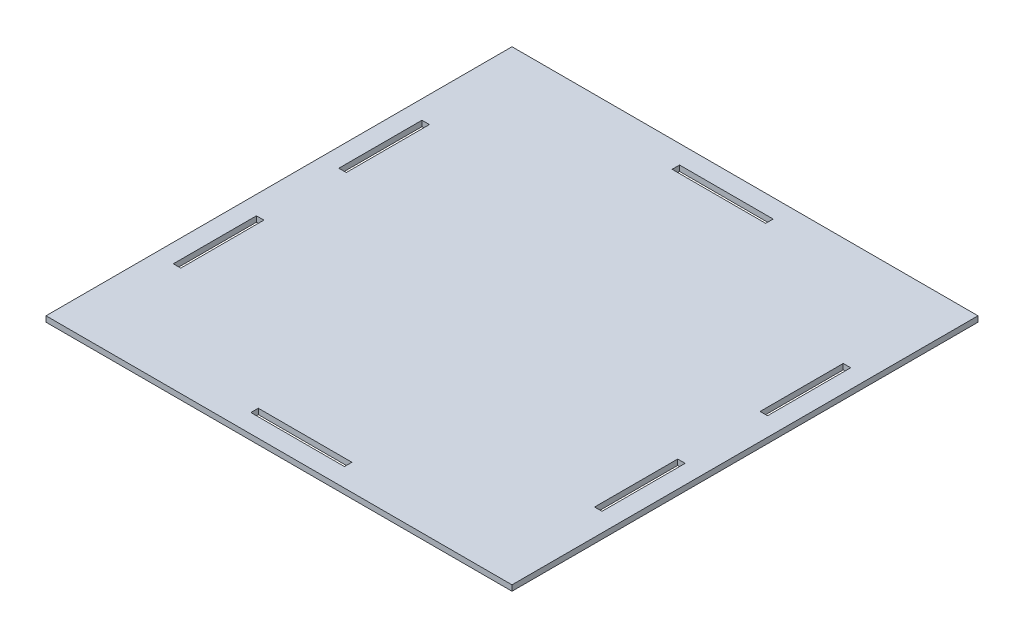
ISO-10303-21;
HEADER;
FILE_DESCRIPTION(('STEP AP214'),'2;1');
FILE_NAME('part.step','',(''),(''),'','','');
FILE_SCHEMA(('AUTOMOTIVE_DESIGN { 1 0 10303 214 1 1 1 1 }'));
ENDSEC;
DATA;
#1=APPLICATION_CONTEXT('core data for automotive mechanical design processes');
#2=APPLICATION_PROTOCOL_DEFINITION('international standard','automotive_design',2000,#1);
#3=PRODUCT_CONTEXT('',#1,'mechanical');
#4=PRODUCT('Part','Part','',(#3));
#5=PRODUCT_RELATED_PRODUCT_CATEGORY('part','',(#4));
#6=PRODUCT_DEFINITION_FORMATION('','',#4);
#7=PRODUCT_DEFINITION_CONTEXT('part definition',#1,'design');
#8=PRODUCT_DEFINITION('design','',#6,#7);
#9=PRODUCT_DEFINITION_SHAPE('','',#8);
#10=(LENGTH_UNIT() NAMED_UNIT(*) SI_UNIT(.MILLI.,.METRE.));
#11=(NAMED_UNIT(*) PLANE_ANGLE_UNIT() SI_UNIT($,.RADIAN.));
#12=(NAMED_UNIT(*) SI_UNIT($,.STERADIAN.) SOLID_ANGLE_UNIT());
#13=UNCERTAINTY_MEASURE_WITH_UNIT(LENGTH_MEASURE(1.E-05),#10,'distance_accuracy_value','');
#14=(GEOMETRIC_REPRESENTATION_CONTEXT(3) GLOBAL_UNCERTAINTY_ASSIGNED_CONTEXT((#13)) GLOBAL_UNIT_ASSIGNED_CONTEXT((#10,
#11,#12)) REPRESENTATION_CONTEXT('',''));
#15=CARTESIAN_POINT('',(0.,0.,0.));
#16=DIRECTION('',(0.,0.,1.));
#17=DIRECTION('',(1.,0.,0.));
#18=AXIS2_PLACEMENT_3D('',#15,#16,#17);
#19=CARTESIAN_POINT('',(0.,3.,0.));
#20=DIRECTION('',(0.,1.,0.));
#21=DIRECTION('',(0.,0.,1.));
#22=AXIS2_PLACEMENT_3D('',#19,#20,#21);
#23=PLANE('',#22);
#24=DIRECTION('',(0.,0.,1.));
#25=VECTOR('',#24,1.);
#26=CARTESIAN_POINT('',(-125.,3.,125.));
#27=LINE('',#26,#25);
#28=CARTESIAN_POINT('',(-125.,3.,-125.));
#29=VERTEX_POINT('',#28);
#30=CARTESIAN_POINT('',(-125.,3.,125.));
#31=VERTEX_POINT('',#30);
#32=EDGE_CURVE('E413',#29,#31,#27,.T.);
#33=ORIENTED_EDGE('',*,*,#32,.T.);
#34=DIRECTION('',(1.,0.,0.));
#35=VECTOR('',#34,1.);
#36=CARTESIAN_POINT('',(125.,3.,125.));
#37=LINE('',#36,#35);
#38=CARTESIAN_POINT('',(125.,3.,125.));
#39=VERTEX_POINT('',#38);
#40=EDGE_CURVE('E416',#31,#39,#37,.T.);
#41=ORIENTED_EDGE('',*,*,#40,.T.);
#42=DIRECTION('',(0.,0.,-1.));
#43=VECTOR('',#42,1.);
#44=CARTESIAN_POINT('',(125.,3.,125.));
#45=LINE('',#44,#43);
#46=CARTESIAN_POINT('',(125.,3.,-125.));
#47=VERTEX_POINT('',#46);
#48=EDGE_CURVE('E419',#39,#47,#45,.T.);
#49=ORIENTED_EDGE('',*,*,#48,.T.);
#50=DIRECTION('',(-1.,0.,0.));
#51=VECTOR('',#50,1.);
#52=CARTESIAN_POINT('',(125.,3.,-125.));
#53=LINE('',#52,#51);
#54=EDGE_CURVE('E421',#47,#29,#53,.T.);
#55=ORIENTED_EDGE('',*,*,#54,.T.);
#56=EDGE_LOOP('',(#33,#41,#49,#55));
#57=FACE_BOUND('',#56,.T.);
#58=DIRECTION('',(1.,0.,0.));
#59=VECTOR('',#58,1.);
#60=CARTESIAN_POINT('',(-25.1000000000001,3.,-111.));
#61=LINE('',#60,#59);
#62=CARTESIAN_POINT('',(-25.1000000000001,3.,-111.));
#63=VERTEX_POINT('',#62);
#64=CARTESIAN_POINT('',(25.0999999999999,3.,-111.));
#65=VERTEX_POINT('',#64);
#66=EDGE_CURVE('E384',#63,#65,#61,.T.);
#67=ORIENTED_EDGE('',*,*,#66,.F.);
#68=DIRECTION('',(0.,0.,1.));
#69=VECTOR('',#68,1.);
#70=CARTESIAN_POINT('',(-25.1000000000001,3.,-111.));
#71=LINE('',#70,#69);
#72=CARTESIAN_POINT('',(-25.1000000000001,3.,-115.));
#73=VERTEX_POINT('',#72);
#74=EDGE_CURVE('E382',#73,#63,#71,.T.);
#75=ORIENTED_EDGE('',*,*,#74,.F.);
#76=DIRECTION('',(-1.,0.,0.));
#77=VECTOR('',#76,1.);
#78=CARTESIAN_POINT('',(-25.1000000000001,3.,-115.));
#79=LINE('',#78,#77);
#80=CARTESIAN_POINT('',(25.0999999999999,3.,-115.));
#81=VERTEX_POINT('',#80);
#82=EDGE_CURVE('E390',#81,#73,#79,.T.);
#83=ORIENTED_EDGE('',*,*,#82,.F.);
#84=DIRECTION('',(0.,0.,-1.));
#85=VECTOR('',#84,1.);
#86=CARTESIAN_POINT('',(25.0999999999999,3.,-111.));
#87=LINE('',#86,#85);
#88=EDGE_CURVE('E387',#65,#81,#87,.T.);
#89=ORIENTED_EDGE('',*,*,#88,.F.);
#90=EDGE_LOOP('',(#67,#75,#83,#89));
#91=FACE_BOUND('',#90,.T.);
#92=DIRECTION('',(-1.,0.,0.));
#93=VECTOR('',#92,1.);
#94=CARTESIAN_POINT('',(-25.1000000000001,3.,111.));
#95=LINE('',#94,#93);
#96=CARTESIAN_POINT('',(25.0999999999999,3.,111.));
#97=VERTEX_POINT('',#96);
#98=CARTESIAN_POINT('',(-25.1000000000001,3.,111.));
#99=VERTEX_POINT('',#98);
#100=EDGE_CURVE('E353',#97,#99,#95,.T.);
#101=ORIENTED_EDGE('',*,*,#100,.F.);
#102=DIRECTION('',(0.,0.,-1.));
#103=VECTOR('',#102,1.);
#104=CARTESIAN_POINT('',(25.0999999999999,3.,111.));
#105=LINE('',#104,#103);
#106=CARTESIAN_POINT('',(25.0999999999999,3.,115.));
#107=VERTEX_POINT('',#106);
#108=EDGE_CURVE('E351',#107,#97,#105,.T.);
#109=ORIENTED_EDGE('',*,*,#108,.F.);
#110=DIRECTION('',(1.,0.,0.));
#111=VECTOR('',#110,1.);
#112=CARTESIAN_POINT('',(-25.1000000000001,3.,115.));
#113=LINE('',#112,#111);
#114=CARTESIAN_POINT('',(-25.1000000000001,3.,115.));
#115=VERTEX_POINT('',#114);
#116=EDGE_CURVE('E359',#115,#107,#113,.T.);
#117=ORIENTED_EDGE('',*,*,#116,.F.);
#118=DIRECTION('',(0.,0.,1.));
#119=VECTOR('',#118,1.);
#120=CARTESIAN_POINT('',(-25.1000000000001,3.,111.));
#121=LINE('',#120,#119);
#122=EDGE_CURVE('E356',#99,#115,#121,.T.);
#123=ORIENTED_EDGE('',*,*,#122,.F.);
#124=EDGE_LOOP('',(#101,#109,#117,#123));
#125=FACE_BOUND('',#124,.T.);
#126=DIRECTION('',(-1.,0.,0.));
#127=VECTOR('',#126,1.);
#128=CARTESIAN_POINT('',(111.,3.,22.1000000000004));
#129=LINE('',#128,#127);
#130=CARTESIAN_POINT('',(115.,3.,22.1000000000004));
#131=VERTEX_POINT('',#130);
#132=CARTESIAN_POINT('',(111.,3.,22.1000000000004));
#133=VERTEX_POINT('',#132);
#134=EDGE_CURVE('E322',#131,#133,#129,.T.);
#135=ORIENTED_EDGE('',*,*,#134,.F.);
#136=DIRECTION('',(0.,0.,-1.));
#137=VECTOR('',#136,1.);
#138=CARTESIAN_POINT('',(115.,3.,22.1000000000004));
#139=LINE('',#138,#137);
#140=CARTESIAN_POINT('',(115.,3.,66.7000000000004));
#141=VERTEX_POINT('',#140);
#142=EDGE_CURVE('E320',#141,#131,#139,.T.);
#143=ORIENTED_EDGE('',*,*,#142,.F.);
#144=DIRECTION('',(1.,0.,0.));
#145=VECTOR('',#144,1.);
#146=CARTESIAN_POINT('',(111.,3.,66.7000000000004));
#147=LINE('',#146,#145);
#148=CARTESIAN_POINT('',(111.,3.,66.7000000000004));
#149=VERTEX_POINT('',#148);
#150=EDGE_CURVE('E328',#149,#141,#147,.T.);
#151=ORIENTED_EDGE('',*,*,#150,.F.);
#152=DIRECTION('',(0.,0.,1.));
#153=VECTOR('',#152,1.);
#154=CARTESIAN_POINT('',(111.,3.,22.1000000000004));
#155=LINE('',#154,#153);
#156=EDGE_CURVE('E325',#133,#149,#155,.T.);
#157=ORIENTED_EDGE('',*,*,#156,.F.);
#158=EDGE_LOOP('',(#135,#143,#151,#157));
#159=FACE_BOUND('',#158,.T.);
#160=DIRECTION('',(-1.,0.,0.));
#161=VECTOR('',#160,1.);
#162=CARTESIAN_POINT('',(-111.,3.,22.1000000000004));
#163=LINE('',#162,#161);
#164=CARTESIAN_POINT('',(-111.,3.,22.1000000000004));
#165=VERTEX_POINT('',#164);
#166=CARTESIAN_POINT('',(-115.,3.,22.1000000000004));
#167=VERTEX_POINT('',#166);
#168=EDGE_CURVE('E291',#165,#167,#163,.T.);
#169=ORIENTED_EDGE('',*,*,#168,.F.);
#170=DIRECTION('',(0.,0.,-1.));
#171=VECTOR('',#170,1.);
#172=CARTESIAN_POINT('',(-111.,3.,22.1000000000004));
#173=LINE('',#172,#171);
#174=CARTESIAN_POINT('',(-111.,3.,66.7000000000004));
#175=VERTEX_POINT('',#174);
#176=EDGE_CURVE('E289',#175,#165,#173,.T.);
#177=ORIENTED_EDGE('',*,*,#176,.F.);
#178=DIRECTION('',(1.,0.,0.));
#179=VECTOR('',#178,1.);
#180=CARTESIAN_POINT('',(-111.,3.,66.7000000000004));
#181=LINE('',#180,#179);
#182=CARTESIAN_POINT('',(-115.,3.,66.7000000000004));
#183=VERTEX_POINT('',#182);
#184=EDGE_CURVE('E297',#183,#175,#181,.T.);
#185=ORIENTED_EDGE('',*,*,#184,.F.);
#186=DIRECTION('',(0.,0.,1.));
#187=VECTOR('',#186,1.);
#188=CARTESIAN_POINT('',(-115.,3.,22.1000000000004));
#189=LINE('',#188,#187);
#190=EDGE_CURVE('E294',#167,#183,#189,.T.);
#191=ORIENTED_EDGE('',*,*,#190,.F.);
#192=EDGE_LOOP('',(#169,#177,#185,#191));
#193=FACE_BOUND('',#192,.T.);
#194=DIRECTION('',(1.,0.,0.));
#195=VECTOR('',#194,1.);
#196=CARTESIAN_POINT('',(111.,3.,-22.1000000000004));
#197=LINE('',#196,#195);
#198=CARTESIAN_POINT('',(111.,3.,-22.1000000000004));
#199=VERTEX_POINT('',#198);
#200=CARTESIAN_POINT('',(115.,3.,-22.1000000000004));
#201=VERTEX_POINT('',#200);
#202=EDGE_CURVE('E260',#199,#201,#197,.T.);
#203=ORIENTED_EDGE('',*,*,#202,.F.);
#204=DIRECTION('',(0.,0.,1.));
#205=VECTOR('',#204,1.);
#206=CARTESIAN_POINT('',(111.,3.,-22.1000000000004));
#207=LINE('',#206,#205);
#208=CARTESIAN_POINT('',(111.,3.,-66.7000000000004));
#209=VERTEX_POINT('',#208);
#210=EDGE_CURVE('E258',#209,#199,#207,.T.);
#211=ORIENTED_EDGE('',*,*,#210,.F.);
#212=DIRECTION('',(-1.,0.,0.));
#213=VECTOR('',#212,1.);
#214=CARTESIAN_POINT('',(111.,3.,-66.7000000000004));
#215=LINE('',#214,#213);
#216=CARTESIAN_POINT('',(115.,3.,-66.7000000000004));
#217=VERTEX_POINT('',#216);
#218=EDGE_CURVE('E266',#217,#209,#215,.T.);
#219=ORIENTED_EDGE('',*,*,#218,.F.);
#220=DIRECTION('',(0.,0.,-1.));
#221=VECTOR('',#220,1.);
#222=CARTESIAN_POINT('',(115.,3.,-22.1000000000004));
#223=LINE('',#222,#221);
#224=EDGE_CURVE('E263',#201,#217,#223,.T.);
#225=ORIENTED_EDGE('',*,*,#224,.F.);
#226=EDGE_LOOP('',(#203,#211,#219,#225));
#227=FACE_BOUND('',#226,.T.);
#228=DIRECTION('',(0.,0.,-1.));
#229=VECTOR('',#228,1.);
#230=CARTESIAN_POINT('',(-111.,3.,-22.1000000000003));
#231=LINE('',#230,#229);
#232=CARTESIAN_POINT('',(-111.,3.,-22.1000000000003));
#233=VERTEX_POINT('',#232);
#234=CARTESIAN_POINT('',(-111.,3.,-66.7000000000004));
#235=VERTEX_POINT('',#234);
#236=EDGE_CURVE('E230',#233,#235,#231,.T.);
#237=ORIENTED_EDGE('',*,*,#236,.F.);
#238=DIRECTION('',(1.,0.,0.));
#239=VECTOR('',#238,1.);
#240=CARTESIAN_POINT('',(-111.,3.,-22.1000000000003));
#241=LINE('',#240,#239);
#242=CARTESIAN_POINT('',(-115.,3.,-22.1000000000003));
#243=VERTEX_POINT('',#242);
#244=EDGE_CURVE('E222',#243,#233,#241,.T.);
#245=ORIENTED_EDGE('',*,*,#244,.F.);
#246=DIRECTION('',(0.,0.,1.));
#247=VECTOR('',#246,1.);
#248=CARTESIAN_POINT('',(-115.,3.,-22.1000000000003));
#249=LINE('',#248,#247);
#250=CARTESIAN_POINT('',(-115.,3.,-66.7000000000004));
#251=VERTEX_POINT('',#250);
#252=EDGE_CURVE('E244',#251,#243,#249,.T.);
#253=ORIENTED_EDGE('',*,*,#252,.F.);
#254=DIRECTION('',(-1.,0.,0.));
#255=VECTOR('',#254,1.);
#256=CARTESIAN_POINT('',(-111.,3.,-66.7000000000004));
#257=LINE('',#256,#255);
#258=EDGE_CURVE('E242',#235,#251,#257,.T.);
#259=ORIENTED_EDGE('',*,*,#258,.F.);
#260=EDGE_LOOP('',(#237,#245,#253,#259));
#261=FACE_BOUND('',#260,.T.);
#262=ADVANCED_FACE('F37',(#57,#91,#125,#159,#193,#227,#261),#23,.T.);
#263=CARTESIAN_POINT('',(0.,0.,0.));
#264=DIRECTION('',(0.,1.,0.));
#265=DIRECTION('',(0.,0.,1.));
#266=AXIS2_PLACEMENT_3D('',#263,#264,#265);
#267=PLANE('',#266);
#268=DIRECTION('',(0.,0.,1.));
#269=VECTOR('',#268,1.);
#270=CARTESIAN_POINT('',(111.,0.,-22.1000000000004));
#271=LINE('',#270,#269);
#272=CARTESIAN_POINT('',(111.,0.,-66.7000000000004));
#273=VERTEX_POINT('',#272);
#274=CARTESIAN_POINT('',(111.,0.,-22.1000000000004));
#275=VERTEX_POINT('',#274);
#276=EDGE_CURVE('E238',#273,#275,#271,.T.);
#277=ORIENTED_EDGE('',*,*,#276,.T.);
#278=DIRECTION('',(1.,0.,0.));
#279=VECTOR('',#278,1.);
#280=CARTESIAN_POINT('',(111.,0.,-22.1000000000004));
#281=LINE('',#280,#279);
#282=CARTESIAN_POINT('',(115.,0.,-22.1000000000004));
#283=VERTEX_POINT('',#282);
#284=EDGE_CURVE('E271',#275,#283,#281,.T.);
#285=ORIENTED_EDGE('',*,*,#284,.T.);
#286=DIRECTION('',(0.,0.,-1.));
#287=VECTOR('',#286,1.);
#288=CARTESIAN_POINT('',(115.,0.,-22.1000000000004));
#289=LINE('',#288,#287);
#290=CARTESIAN_POINT('',(115.,0.,-66.7000000000004));
#291=VERTEX_POINT('',#290);
#292=EDGE_CURVE('E274',#283,#291,#289,.T.);
#293=ORIENTED_EDGE('',*,*,#292,.T.);
#294=DIRECTION('',(-1.,0.,0.));
#295=VECTOR('',#294,1.);
#296=CARTESIAN_POINT('',(111.,0.,-66.7000000000004));
#297=LINE('',#296,#295);
#298=EDGE_CURVE('E261',#291,#273,#297,.T.);
#299=ORIENTED_EDGE('',*,*,#298,.T.);
#300=EDGE_LOOP('',(#277,#285,#293,#299));
#301=FACE_BOUND('',#300,.T.);
#302=DIRECTION('',(0.,0.,-1.));
#303=VECTOR('',#302,1.);
#304=CARTESIAN_POINT('',(115.,0.,22.1000000000004));
#305=LINE('',#304,#303);
#306=CARTESIAN_POINT('',(115.,0.,66.7000000000004));
#307=VERTEX_POINT('',#306);
#308=CARTESIAN_POINT('',(115.,0.,22.1000000000004));
#309=VERTEX_POINT('',#308);
#310=EDGE_CURVE('E319',#307,#309,#305,.T.);
#311=ORIENTED_EDGE('',*,*,#310,.T.);
#312=DIRECTION('',(-1.,0.,0.));
#313=VECTOR('',#312,1.);
#314=CARTESIAN_POINT('',(111.,0.,22.1000000000004));
#315=LINE('',#314,#313);
#316=CARTESIAN_POINT('',(111.,0.,22.1000000000004));
#317=VERTEX_POINT('',#316);
#318=EDGE_CURVE('E333',#309,#317,#315,.T.);
#319=ORIENTED_EDGE('',*,*,#318,.T.);
#320=DIRECTION('',(0.,0.,1.));
#321=VECTOR('',#320,1.);
#322=CARTESIAN_POINT('',(111.,0.,22.1000000000004));
#323=LINE('',#322,#321);
#324=CARTESIAN_POINT('',(111.,0.,66.7000000000004));
#325=VERTEX_POINT('',#324);
#326=EDGE_CURVE('E336',#317,#325,#323,.T.);
#327=ORIENTED_EDGE('',*,*,#326,.T.);
#328=DIRECTION('',(1.,0.,0.));
#329=VECTOR('',#328,1.);
#330=CARTESIAN_POINT('',(111.,0.,66.7000000000004));
#331=LINE('',#330,#329);
#332=EDGE_CURVE('E323',#325,#307,#331,.T.);
#333=ORIENTED_EDGE('',*,*,#332,.T.);
#334=EDGE_LOOP('',(#311,#319,#327,#333));
#335=FACE_BOUND('',#334,.T.);
#336=DIRECTION('',(0.,0.,1.));
#337=VECTOR('',#336,1.);
#338=CARTESIAN_POINT('',(-25.1000000000001,0.,-111.));
#339=LINE('',#338,#337);
#340=CARTESIAN_POINT('',(-25.1000000000001,0.,-115.));
#341=VERTEX_POINT('',#340);
#342=CARTESIAN_POINT('',(-25.1000000000001,0.,-111.));
#343=VERTEX_POINT('',#342);
#344=EDGE_CURVE('E381',#341,#343,#339,.T.);
#345=ORIENTED_EDGE('',*,*,#344,.T.);
#346=DIRECTION('',(1.,0.,0.));
#347=VECTOR('',#346,1.);
#348=CARTESIAN_POINT('',(-25.1000000000001,0.,-111.));
#349=LINE('',#348,#347);
#350=CARTESIAN_POINT('',(25.0999999999999,0.,-111.));
#351=VERTEX_POINT('',#350);
#352=EDGE_CURVE('E395',#343,#351,#349,.T.);
#353=ORIENTED_EDGE('',*,*,#352,.T.);
#354=DIRECTION('',(0.,0.,-1.));
#355=VECTOR('',#354,1.);
#356=CARTESIAN_POINT('',(25.0999999999999,0.,-111.));
#357=LINE('',#356,#355);
#358=CARTESIAN_POINT('',(25.0999999999999,0.,-115.));
#359=VERTEX_POINT('',#358);
#360=EDGE_CURVE('E398',#351,#359,#357,.T.);
#361=ORIENTED_EDGE('',*,*,#360,.T.);
#362=DIRECTION('',(-1.,0.,0.));
#363=VECTOR('',#362,1.);
#364=CARTESIAN_POINT('',(-25.1000000000001,0.,-115.));
#365=LINE('',#364,#363);
#366=EDGE_CURVE('E385',#359,#341,#365,.T.);
#367=ORIENTED_EDGE('',*,*,#366,.T.);
#368=EDGE_LOOP('',(#345,#353,#361,#367));
#369=FACE_BOUND('',#368,.T.);
#370=DIRECTION('',(0.,0.,1.));
#371=VECTOR('',#370,1.);
#372=CARTESIAN_POINT('',(-125.,0.,125.));
#373=LINE('',#372,#371);
#374=CARTESIAN_POINT('',(-125.,0.,-125.));
#375=VERTEX_POINT('',#374);
#376=CARTESIAN_POINT('',(-125.,0.,125.));
#377=VERTEX_POINT('',#376);
#378=EDGE_CURVE('E412',#375,#377,#373,.T.);
#379=ORIENTED_EDGE('',*,*,#378,.F.);
#380=DIRECTION('',(-1.,0.,0.));
#381=VECTOR('',#380,1.);
#382=CARTESIAN_POINT('',(125.,0.,-125.));
#383=LINE('',#382,#381);
#384=CARTESIAN_POINT('',(125.,0.,-125.));
#385=VERTEX_POINT('',#384);
#386=EDGE_CURVE('E417',#385,#375,#383,.T.);
#387=ORIENTED_EDGE('',*,*,#386,.F.);
#388=DIRECTION('',(0.,0.,-1.));
#389=VECTOR('',#388,1.);
#390=CARTESIAN_POINT('',(125.,0.,125.));
#391=LINE('',#390,#389);
#392=CARTESIAN_POINT('',(125.,0.,125.));
#393=VERTEX_POINT('',#392);
#394=EDGE_CURVE('E428',#393,#385,#391,.T.);
#395=ORIENTED_EDGE('',*,*,#394,.F.);
#396=DIRECTION('',(1.,0.,0.));
#397=VECTOR('',#396,1.);
#398=CARTESIAN_POINT('',(125.,0.,125.));
#399=LINE('',#398,#397);
#400=EDGE_CURVE('E426',#377,#393,#399,.T.);
#401=ORIENTED_EDGE('',*,*,#400,.F.);
#402=EDGE_LOOP('',(#379,#387,#395,#401));
#403=FACE_BOUND('',#402,.T.);
#404=DIRECTION('',(0.,0.,-1.));
#405=VECTOR('',#404,1.);
#406=CARTESIAN_POINT('',(25.0999999999999,0.,111.));
#407=LINE('',#406,#405);
#408=CARTESIAN_POINT('',(25.0999999999999,0.,115.));
#409=VERTEX_POINT('',#408);
#410=CARTESIAN_POINT('',(25.0999999999999,0.,111.));
#411=VERTEX_POINT('',#410);
#412=EDGE_CURVE('E350',#409,#411,#407,.T.);
#413=ORIENTED_EDGE('',*,*,#412,.T.);
#414=DIRECTION('',(-1.,0.,0.));
#415=VECTOR('',#414,1.);
#416=CARTESIAN_POINT('',(-25.1000000000001,0.,111.));
#417=LINE('',#416,#415);
#418=CARTESIAN_POINT('',(-25.1000000000001,0.,111.));
#419=VERTEX_POINT('',#418);
#420=EDGE_CURVE('E364',#411,#419,#417,.T.);
#421=ORIENTED_EDGE('',*,*,#420,.T.);
#422=DIRECTION('',(0.,0.,1.));
#423=VECTOR('',#422,1.);
#424=CARTESIAN_POINT('',(-25.1000000000001,0.,111.));
#425=LINE('',#424,#423);
#426=CARTESIAN_POINT('',(-25.1000000000001,0.,115.));
#427=VERTEX_POINT('',#426);
#428=EDGE_CURVE('E367',#419,#427,#425,.T.);
#429=ORIENTED_EDGE('',*,*,#428,.T.);
#430=DIRECTION('',(1.,0.,0.));
#431=VECTOR('',#430,1.);
#432=CARTESIAN_POINT('',(-25.1000000000001,0.,115.));
#433=LINE('',#432,#431);
#434=EDGE_CURVE('E354',#427,#409,#433,.T.);
#435=ORIENTED_EDGE('',*,*,#434,.T.);
#436=EDGE_LOOP('',(#413,#421,#429,#435));
#437=FACE_BOUND('',#436,.T.);
#438=DIRECTION('',(0.,0.,-1.));
#439=VECTOR('',#438,1.);
#440=CARTESIAN_POINT('',(-111.,0.,22.1000000000004));
#441=LINE('',#440,#439);
#442=CARTESIAN_POINT('',(-111.,0.,66.7000000000004));
#443=VERTEX_POINT('',#442);
#444=CARTESIAN_POINT('',(-111.,0.,22.1000000000004));
#445=VERTEX_POINT('',#444);
#446=EDGE_CURVE('E288',#443,#445,#441,.T.);
#447=ORIENTED_EDGE('',*,*,#446,.T.);
#448=DIRECTION('',(-1.,0.,0.));
#449=VECTOR('',#448,1.);
#450=CARTESIAN_POINT('',(-111.,0.,22.1000000000004));
#451=LINE('',#450,#449);
#452=CARTESIAN_POINT('',(-115.,0.,22.1000000000004));
#453=VERTEX_POINT('',#452);
#454=EDGE_CURVE('E302',#445,#453,#451,.T.);
#455=ORIENTED_EDGE('',*,*,#454,.T.);
#456=DIRECTION('',(0.,0.,1.));
#457=VECTOR('',#456,1.);
#458=CARTESIAN_POINT('',(-115.,0.,22.1000000000004));
#459=LINE('',#458,#457);
#460=CARTESIAN_POINT('',(-115.,0.,66.7000000000004));
#461=VERTEX_POINT('',#460);
#462=EDGE_CURVE('E305',#453,#461,#459,.T.);
#463=ORIENTED_EDGE('',*,*,#462,.T.);
#464=DIRECTION('',(1.,0.,0.));
#465=VECTOR('',#464,1.);
#466=CARTESIAN_POINT('',(-111.,0.,66.7000000000004));
#467=LINE('',#466,#465);
#468=EDGE_CURVE('E292',#461,#443,#467,.T.);
#469=ORIENTED_EDGE('',*,*,#468,.T.);
#470=EDGE_LOOP('',(#447,#455,#463,#469));
#471=FACE_BOUND('',#470,.T.);
#472=DIRECTION('',(1.,0.,0.));
#473=VECTOR('',#472,1.);
#474=CARTESIAN_POINT('',(-111.,0.,-22.1000000000003));
#475=LINE('',#474,#473);
#476=CARTESIAN_POINT('',(-115.,0.,-22.1000000000003));
#477=VERTEX_POINT('',#476);
#478=CARTESIAN_POINT('',(-111.,0.,-22.1000000000003));
#479=VERTEX_POINT('',#478);
#480=EDGE_CURVE('E60',#477,#479,#475,.T.);
#481=ORIENTED_EDGE('',*,*,#480,.T.);
#482=DIRECTION('',(0.,0.,-1.));
#483=VECTOR('',#482,1.);
#484=CARTESIAN_POINT('',(-111.,0.,-22.1000000000003));
#485=LINE('',#484,#483);
#486=CARTESIAN_POINT('',(-111.,0.,-66.7000000000004));
#487=VERTEX_POINT('',#486);
#488=EDGE_CURVE('E237',#479,#487,#485,.T.);
#489=ORIENTED_EDGE('',*,*,#488,.T.);
#490=DIRECTION('',(-1.,0.,0.));
#491=VECTOR('',#490,1.);
#492=CARTESIAN_POINT('',(-111.,0.,-66.7000000000004));
#493=LINE('',#492,#491);
#494=CARTESIAN_POINT('',(-115.,0.,-66.7000000000004));
#495=VERTEX_POINT('',#494);
#496=EDGE_CURVE('E250',#487,#495,#493,.T.);
#497=ORIENTED_EDGE('',*,*,#496,.T.);
#498=DIRECTION('',(0.,0.,1.));
#499=VECTOR('',#498,1.);
#500=CARTESIAN_POINT('',(-115.,0.,-22.1000000000003));
#501=LINE('',#500,#499);
#502=EDGE_CURVE('E231',#495,#477,#501,.T.);
#503=ORIENTED_EDGE('',*,*,#502,.T.);
#504=EDGE_LOOP('',(#481,#489,#497,#503));
#505=FACE_BOUND('',#504,.T.);
#506=ADVANCED_FACE('F446',(#301,#335,#369,#403,#437,#471,#505),#267,.F.);
#507=CARTESIAN_POINT('',(-125.,3.,125.));
#508=DIRECTION('',(1.,0.,0.));
#509=DIRECTION('',(0.,0.,-1.));
#510=AXIS2_PLACEMENT_3D('',#507,#508,#509);
#511=PLANE('',#510);
#512=ORIENTED_EDGE('',*,*,#378,.T.);
#513=DIRECTION('',(0.,-1.,0.));
#514=VECTOR('',#513,1.);
#515=CARTESIAN_POINT('',(-125.,3.,125.));
#516=LINE('',#515,#514);
#517=EDGE_CURVE('E11',#31,#377,#516,.T.);
#518=ORIENTED_EDGE('',*,*,#517,.F.);
#519=ORIENTED_EDGE('',*,*,#32,.F.);
#520=DIRECTION('',(0.,-1.,0.));
#521=VECTOR('',#520,1.);
#522=CARTESIAN_POINT('',(-125.,3.,-125.));
#523=LINE('',#522,#521);
#524=EDGE_CURVE('E423',#29,#375,#523,.T.);
#525=ORIENTED_EDGE('',*,*,#524,.T.);
#526=EDGE_LOOP('',(#512,#518,#519,#525));
#527=FACE_BOUND('',#526,.T.);
#528=ADVANCED_FACE('F39',(#527),#511,.F.);
#529=CARTESIAN_POINT('',(125.,3.,125.));
#530=DIRECTION('',(0.,0.,-1.));
#531=DIRECTION('',(-1.,0.,0.));
#532=AXIS2_PLACEMENT_3D('',#529,#530,#531);
#533=PLANE('',#532);
#534=ORIENTED_EDGE('',*,*,#400,.T.);
#535=DIRECTION('',(0.,-1.,0.));
#536=VECTOR('',#535,1.);
#537=CARTESIAN_POINT('',(125.,3.,125.));
#538=LINE('',#537,#536);
#539=EDGE_CURVE('E45',#39,#393,#538,.T.);
#540=ORIENTED_EDGE('',*,*,#539,.F.);
#541=ORIENTED_EDGE('',*,*,#40,.F.);
#542=ORIENTED_EDGE('',*,*,#517,.T.);
#543=EDGE_LOOP('',(#534,#540,#541,#542));
#544=FACE_BOUND('',#543,.T.);
#545=ADVANCED_FACE('F457',(#544),#533,.F.);
#546=CARTESIAN_POINT('',(125.,3.,125.));
#547=DIRECTION('',(-1.,0.,0.));
#548=DIRECTION('',(0.,0.,1.));
#549=AXIS2_PLACEMENT_3D('',#546,#547,#548);
#550=PLANE('',#549);
#551=ORIENTED_EDGE('',*,*,#394,.T.);
#552=DIRECTION('',(0.,-1.,0.));
#553=VECTOR('',#552,1.);
#554=CARTESIAN_POINT('',(125.,3.,-125.));
#555=LINE('',#554,#553);
#556=EDGE_CURVE('E433',#47,#385,#555,.T.);
#557=ORIENTED_EDGE('',*,*,#556,.F.);
#558=ORIENTED_EDGE('',*,*,#48,.F.);
#559=ORIENTED_EDGE('',*,*,#539,.T.);
#560=EDGE_LOOP('',(#551,#557,#558,#559));
#561=FACE_BOUND('',#560,.T.);
#562=ADVANCED_FACE('F440',(#561),#550,.F.);
#563=CARTESIAN_POINT('',(125.,3.,-125.));
#564=DIRECTION('',(0.,0.,1.));
#565=DIRECTION('',(1.,0.,0.));
#566=AXIS2_PLACEMENT_3D('',#563,#564,#565);
#567=PLANE('',#566);
#568=ORIENTED_EDGE('',*,*,#386,.T.);
#569=ORIENTED_EDGE('',*,*,#524,.F.);
#570=ORIENTED_EDGE('',*,*,#54,.F.);
#571=ORIENTED_EDGE('',*,*,#556,.T.);
#572=EDGE_LOOP('',(#568,#569,#570,#571));
#573=FACE_BOUND('',#572,.T.);
#574=ADVANCED_FACE('F450',(#573),#567,.F.);
#575=CARTESIAN_POINT('',(-25.1000000000001,3.,-111.));
#576=DIRECTION('',(1.,0.,0.));
#577=DIRECTION('',(0.,0.,-1.));
#578=AXIS2_PLACEMENT_3D('',#575,#576,#577);
#579=PLANE('',#578);
#580=ORIENTED_EDGE('',*,*,#344,.F.);
#581=DIRECTION('',(0.,-1.,0.));
#582=VECTOR('',#581,1.);
#583=CARTESIAN_POINT('',(-25.1000000000001,3.,-115.));
#584=LINE('',#583,#582);
#585=EDGE_CURVE('E392',#73,#341,#584,.T.);
#586=ORIENTED_EDGE('',*,*,#585,.F.);
#587=ORIENTED_EDGE('',*,*,#74,.T.);
#588=DIRECTION('',(0.,-1.,0.));
#589=VECTOR('',#588,1.);
#590=CARTESIAN_POINT('',(-25.1000000000001,3.,-111.));
#591=LINE('',#590,#589);
#592=EDGE_CURVE('E409',#63,#343,#591,.T.);
#593=ORIENTED_EDGE('',*,*,#592,.T.);
#594=EDGE_LOOP('',(#580,#586,#587,#593));
#595=FACE_BOUND('',#594,.T.);
#596=ADVANCED_FACE('F472',(#595),#579,.T.);
#597=CARTESIAN_POINT('',(-25.1000000000001,3.,-111.));
#598=DIRECTION('',(0.,0.,-1.));
#599=DIRECTION('',(-1.,0.,0.));
#600=AXIS2_PLACEMENT_3D('',#597,#598,#599);
#601=PLANE('',#600);
#602=ORIENTED_EDGE('',*,*,#352,.F.);
#603=ORIENTED_EDGE('',*,*,#592,.F.);
#604=ORIENTED_EDGE('',*,*,#66,.T.);
#605=DIRECTION('',(0.,-1.,0.));
#606=VECTOR('',#605,1.);
#607=CARTESIAN_POINT('',(25.0999999999999,3.,-111.));
#608=LINE('',#607,#606);
#609=EDGE_CURVE('E407',#65,#351,#608,.T.);
#610=ORIENTED_EDGE('',*,*,#609,.T.);
#611=EDGE_LOOP('',(#602,#603,#604,#610));
#612=FACE_BOUND('',#611,.T.);
#613=ADVANCED_FACE('F479',(#612),#601,.T.);
#614=CARTESIAN_POINT('',(25.0999999999999,3.,-111.));
#615=DIRECTION('',(-1.,0.,0.));
#616=DIRECTION('',(0.,0.,1.));
#617=AXIS2_PLACEMENT_3D('',#614,#615,#616);
#618=PLANE('',#617);
#619=ORIENTED_EDGE('',*,*,#360,.F.);
#620=ORIENTED_EDGE('',*,*,#609,.F.);
#621=ORIENTED_EDGE('',*,*,#88,.T.);
#622=DIRECTION('',(0.,-1.,0.));
#623=VECTOR('',#622,1.);
#624=CARTESIAN_POINT('',(25.0999999999999,3.,-115.));
#625=LINE('',#624,#623);
#626=EDGE_CURVE('E405',#81,#359,#625,.T.);
#627=ORIENTED_EDGE('',*,*,#626,.T.);
#628=EDGE_LOOP('',(#619,#620,#621,#627));
#629=FACE_BOUND('',#628,.T.);
#630=ADVANCED_FACE('F484',(#629),#618,.T.);
#631=CARTESIAN_POINT('',(-25.1000000000001,3.,-115.));
#632=DIRECTION('',(0.,0.,1.));
#633=DIRECTION('',(1.,0.,0.));
#634=AXIS2_PLACEMENT_3D('',#631,#632,#633);
#635=PLANE('',#634);
#636=ORIENTED_EDGE('',*,*,#366,.F.);
#637=ORIENTED_EDGE('',*,*,#626,.F.);
#638=ORIENTED_EDGE('',*,*,#82,.T.);
#639=ORIENTED_EDGE('',*,*,#585,.T.);
#640=EDGE_LOOP('',(#636,#637,#638,#639));
#641=FACE_BOUND('',#640,.T.);
#642=ADVANCED_FACE('F492',(#641),#635,.T.);
#643=CARTESIAN_POINT('',(25.0999999999999,3.,111.));
#644=DIRECTION('',(-1.,0.,0.));
#645=DIRECTION('',(0.,0.,1.));
#646=AXIS2_PLACEMENT_3D('',#643,#644,#645);
#647=PLANE('',#646);
#648=ORIENTED_EDGE('',*,*,#412,.F.);
#649=DIRECTION('',(0.,-1.,0.));
#650=VECTOR('',#649,1.);
#651=CARTESIAN_POINT('',(25.0999999999999,3.,115.));
#652=LINE('',#651,#650);
#653=EDGE_CURVE('E361',#107,#409,#652,.T.);
#654=ORIENTED_EDGE('',*,*,#653,.F.);
#655=ORIENTED_EDGE('',*,*,#108,.T.);
#656=DIRECTION('',(0.,-1.,0.));
#657=VECTOR('',#656,1.);
#658=CARTESIAN_POINT('',(25.0999999999999,3.,111.));
#659=LINE('',#658,#657);
#660=EDGE_CURVE('E378',#97,#411,#659,.T.);
#661=ORIENTED_EDGE('',*,*,#660,.T.);
#662=EDGE_LOOP('',(#648,#654,#655,#661));
#663=FACE_BOUND('',#662,.T.);
#664=ADVANCED_FACE('F587',(#663),#647,.T.);
#665=CARTESIAN_POINT('',(-25.1000000000001,3.,111.));
#666=DIRECTION('',(0.,0.,1.));
#667=DIRECTION('',(1.,0.,0.));
#668=AXIS2_PLACEMENT_3D('',#665,#666,#667);
#669=PLANE('',#668);
#670=ORIENTED_EDGE('',*,*,#420,.F.);
#671=ORIENTED_EDGE('',*,*,#660,.F.);
#672=ORIENTED_EDGE('',*,*,#100,.T.);
#673=DIRECTION('',(0.,-1.,0.));
#674=VECTOR('',#673,1.);
#675=CARTESIAN_POINT('',(-25.1000000000001,3.,111.));
#676=LINE('',#675,#674);
#677=EDGE_CURVE('E376',#99,#419,#676,.T.);
#678=ORIENTED_EDGE('',*,*,#677,.T.);
#679=EDGE_LOOP('',(#670,#671,#672,#678));
#680=FACE_BOUND('',#679,.T.);
#681=ADVANCED_FACE('F583',(#680),#669,.T.);
#682=CARTESIAN_POINT('',(-25.1000000000001,3.,111.));
#683=DIRECTION('',(1.,0.,0.));
#684=DIRECTION('',(0.,0.,-1.));
#685=AXIS2_PLACEMENT_3D('',#682,#683,#684);
#686=PLANE('',#685);
#687=ORIENTED_EDGE('',*,*,#428,.F.);
#688=ORIENTED_EDGE('',*,*,#677,.F.);
#689=ORIENTED_EDGE('',*,*,#122,.T.);
#690=DIRECTION('',(0.,-1.,0.));
#691=VECTOR('',#690,1.);
#692=CARTESIAN_POINT('',(-25.1000000000001,3.,115.));
#693=LINE('',#692,#691);
#694=EDGE_CURVE('E374',#115,#427,#693,.T.);
#695=ORIENTED_EDGE('',*,*,#694,.T.);
#696=EDGE_LOOP('',(#687,#688,#689,#695));
#697=FACE_BOUND('',#696,.T.);
#698=ADVANCED_FACE('F579',(#697),#686,.T.);
#699=CARTESIAN_POINT('',(-25.1000000000001,3.,115.));
#700=DIRECTION('',(0.,0.,-1.));
#701=DIRECTION('',(-1.,0.,0.));
#702=AXIS2_PLACEMENT_3D('',#699,#700,#701);
#703=PLANE('',#702);
#704=ORIENTED_EDGE('',*,*,#434,.F.);
#705=ORIENTED_EDGE('',*,*,#694,.F.);
#706=ORIENTED_EDGE('',*,*,#116,.T.);
#707=ORIENTED_EDGE('',*,*,#653,.T.);
#708=EDGE_LOOP('',(#704,#705,#706,#707));
#709=FACE_BOUND('',#708,.T.);
#710=ADVANCED_FACE('F575',(#709),#703,.T.);
#711=CARTESIAN_POINT('',(115.,3.,22.1000000000004));
#712=DIRECTION('',(-1.,0.,0.));
#713=DIRECTION('',(0.,0.,1.));
#714=AXIS2_PLACEMENT_3D('',#711,#712,#713);
#715=PLANE('',#714);
#716=ORIENTED_EDGE('',*,*,#310,.F.);
#717=DIRECTION('',(0.,-1.,0.));
#718=VECTOR('',#717,1.);
#719=CARTESIAN_POINT('',(115.,3.,66.7000000000004));
#720=LINE('',#719,#718);
#721=EDGE_CURVE('E330',#141,#307,#720,.T.);
#722=ORIENTED_EDGE('',*,*,#721,.F.);
#723=ORIENTED_EDGE('',*,*,#142,.T.);
#724=DIRECTION('',(0.,-1.,0.));
#725=VECTOR('',#724,1.);
#726=CARTESIAN_POINT('',(115.,3.,22.1000000000004));
#727=LINE('',#726,#725);
#728=EDGE_CURVE('E347',#131,#309,#727,.T.);
#729=ORIENTED_EDGE('',*,*,#728,.T.);
#730=EDGE_LOOP('',(#716,#722,#723,#729));
#731=FACE_BOUND('',#730,.T.);
#732=ADVANCED_FACE('F571',(#731),#715,.T.);
#733=CARTESIAN_POINT('',(111.,3.,22.1000000000004));
#734=DIRECTION('',(0.,0.,1.));
#735=DIRECTION('',(1.,0.,0.));
#736=AXIS2_PLACEMENT_3D('',#733,#734,#735);
#737=PLANE('',#736);
#738=ORIENTED_EDGE('',*,*,#318,.F.);
#739=ORIENTED_EDGE('',*,*,#728,.F.);
#740=ORIENTED_EDGE('',*,*,#134,.T.);
#741=DIRECTION('',(0.,-1.,0.));
#742=VECTOR('',#741,1.);
#743=CARTESIAN_POINT('',(111.,3.,22.1000000000004));
#744=LINE('',#743,#742);
#745=EDGE_CURVE('E345',#133,#317,#744,.T.);
#746=ORIENTED_EDGE('',*,*,#745,.T.);
#747=EDGE_LOOP('',(#738,#739,#740,#746));
#748=FACE_BOUND('',#747,.T.);
#749=ADVANCED_FACE('F567',(#748),#737,.T.);
#750=CARTESIAN_POINT('',(111.,3.,22.1000000000004));
#751=DIRECTION('',(1.,0.,0.));
#752=DIRECTION('',(0.,0.,-1.));
#753=AXIS2_PLACEMENT_3D('',#750,#751,#752);
#754=PLANE('',#753);
#755=ORIENTED_EDGE('',*,*,#326,.F.);
#756=ORIENTED_EDGE('',*,*,#745,.F.);
#757=ORIENTED_EDGE('',*,*,#156,.T.);
#758=DIRECTION('',(0.,-1.,0.));
#759=VECTOR('',#758,1.);
#760=CARTESIAN_POINT('',(111.,3.,66.7000000000004));
#761=LINE('',#760,#759);
#762=EDGE_CURVE('E343',#149,#325,#761,.T.);
#763=ORIENTED_EDGE('',*,*,#762,.T.);
#764=EDGE_LOOP('',(#755,#756,#757,#763));
#765=FACE_BOUND('',#764,.T.);
#766=ADVANCED_FACE('F563',(#765),#754,.T.);
#767=CARTESIAN_POINT('',(111.,3.,66.7000000000004));
#768=DIRECTION('',(0.,0.,-1.));
#769=DIRECTION('',(-1.,0.,0.));
#770=AXIS2_PLACEMENT_3D('',#767,#768,#769);
#771=PLANE('',#770);
#772=ORIENTED_EDGE('',*,*,#332,.F.);
#773=ORIENTED_EDGE('',*,*,#762,.F.);
#774=ORIENTED_EDGE('',*,*,#150,.T.);
#775=ORIENTED_EDGE('',*,*,#721,.T.);
#776=EDGE_LOOP('',(#772,#773,#774,#775));
#777=FACE_BOUND('',#776,.T.);
#778=ADVANCED_FACE('F559',(#777),#771,.T.);
#779=CARTESIAN_POINT('',(-111.,3.,22.1000000000004));
#780=DIRECTION('',(-1.,0.,0.));
#781=DIRECTION('',(0.,0.,1.));
#782=AXIS2_PLACEMENT_3D('',#779,#780,#781);
#783=PLANE('',#782);
#784=ORIENTED_EDGE('',*,*,#446,.F.);
#785=DIRECTION('',(0.,-1.,0.));
#786=VECTOR('',#785,1.);
#787=CARTESIAN_POINT('',(-111.,3.,66.7000000000004));
#788=LINE('',#787,#786);
#789=EDGE_CURVE('E299',#175,#443,#788,.T.);
#790=ORIENTED_EDGE('',*,*,#789,.F.);
#791=ORIENTED_EDGE('',*,*,#176,.T.);
#792=DIRECTION('',(0.,-1.,0.));
#793=VECTOR('',#792,1.);
#794=CARTESIAN_POINT('',(-111.,3.,22.1000000000004));
#795=LINE('',#794,#793);
#796=EDGE_CURVE('E316',#165,#445,#795,.T.);
#797=ORIENTED_EDGE('',*,*,#796,.T.);
#798=EDGE_LOOP('',(#784,#790,#791,#797));
#799=FACE_BOUND('',#798,.T.);
#800=ADVANCED_FACE('F555',(#799),#783,.T.);
#801=CARTESIAN_POINT('',(-111.,3.,22.1000000000004));
#802=DIRECTION('',(0.,0.,1.));
#803=DIRECTION('',(1.,0.,0.));
#804=AXIS2_PLACEMENT_3D('',#801,#802,#803);
#805=PLANE('',#804);
#806=ORIENTED_EDGE('',*,*,#454,.F.);
#807=ORIENTED_EDGE('',*,*,#796,.F.);
#808=ORIENTED_EDGE('',*,*,#168,.T.);
#809=DIRECTION('',(0.,-1.,0.));
#810=VECTOR('',#809,1.);
#811=CARTESIAN_POINT('',(-115.,3.,22.1000000000004));
#812=LINE('',#811,#810);
#813=EDGE_CURVE('E314',#167,#453,#812,.T.);
#814=ORIENTED_EDGE('',*,*,#813,.T.);
#815=EDGE_LOOP('',(#806,#807,#808,#814));
#816=FACE_BOUND('',#815,.T.);
#817=ADVANCED_FACE('F551',(#816),#805,.T.);
#818=CARTESIAN_POINT('',(-115.,3.,22.1000000000004));
#819=DIRECTION('',(1.,0.,0.));
#820=DIRECTION('',(0.,0.,-1.));
#821=AXIS2_PLACEMENT_3D('',#818,#819,#820);
#822=PLANE('',#821);
#823=ORIENTED_EDGE('',*,*,#462,.F.);
#824=ORIENTED_EDGE('',*,*,#813,.F.);
#825=ORIENTED_EDGE('',*,*,#190,.T.);
#826=DIRECTION('',(0.,-1.,0.));
#827=VECTOR('',#826,1.);
#828=CARTESIAN_POINT('',(-115.,3.,66.7000000000004));
#829=LINE('',#828,#827);
#830=EDGE_CURVE('E312',#183,#461,#829,.T.);
#831=ORIENTED_EDGE('',*,*,#830,.T.);
#832=EDGE_LOOP('',(#823,#824,#825,#831));
#833=FACE_BOUND('',#832,.T.);
#834=ADVANCED_FACE('F547',(#833),#822,.T.);
#835=CARTESIAN_POINT('',(-111.,3.,66.7000000000004));
#836=DIRECTION('',(0.,0.,-1.));
#837=DIRECTION('',(-1.,0.,0.));
#838=AXIS2_PLACEMENT_3D('',#835,#836,#837);
#839=PLANE('',#838);
#840=ORIENTED_EDGE('',*,*,#468,.F.);
#841=ORIENTED_EDGE('',*,*,#830,.F.);
#842=ORIENTED_EDGE('',*,*,#184,.T.);
#843=ORIENTED_EDGE('',*,*,#789,.T.);
#844=EDGE_LOOP('',(#840,#841,#842,#843));
#845=FACE_BOUND('',#844,.T.);
#846=ADVANCED_FACE('F544',(#845),#839,.T.);
#847=CARTESIAN_POINT('',(111.,3.,-22.1000000000004));
#848=DIRECTION('',(1.,0.,0.));
#849=DIRECTION('',(0.,0.,-1.));
#850=AXIS2_PLACEMENT_3D('',#847,#848,#849);
#851=PLANE('',#850);
#852=ORIENTED_EDGE('',*,*,#276,.F.);
#853=DIRECTION('',(0.,-1.,0.));
#854=VECTOR('',#853,1.);
#855=CARTESIAN_POINT('',(111.,3.,-66.7000000000004));
#856=LINE('',#855,#854);
#857=EDGE_CURVE('E268',#209,#273,#856,.T.);
#858=ORIENTED_EDGE('',*,*,#857,.F.);
#859=ORIENTED_EDGE('',*,*,#210,.T.);
#860=DIRECTION('',(0.,-1.,0.));
#861=VECTOR('',#860,1.);
#862=CARTESIAN_POINT('',(111.,3.,-22.1000000000004));
#863=LINE('',#862,#861);
#864=EDGE_CURVE('E285',#199,#275,#863,.T.);
#865=ORIENTED_EDGE('',*,*,#864,.T.);
#866=EDGE_LOOP('',(#852,#858,#859,#865));
#867=FACE_BOUND('',#866,.T.);
#868=ADVANCED_FACE('F526',(#867),#851,.T.);
#869=CARTESIAN_POINT('',(111.,3.,-22.1000000000004));
#870=DIRECTION('',(0.,0.,-1.));
#871=DIRECTION('',(-1.,0.,0.));
#872=AXIS2_PLACEMENT_3D('',#869,#870,#871);
#873=PLANE('',#872);
#874=ORIENTED_EDGE('',*,*,#284,.F.);
#875=ORIENTED_EDGE('',*,*,#864,.F.);
#876=ORIENTED_EDGE('',*,*,#202,.T.);
#877=DIRECTION('',(0.,-1.,0.));
#878=VECTOR('',#877,1.);
#879=CARTESIAN_POINT('',(115.,3.,-22.1000000000004));
#880=LINE('',#879,#878);
#881=EDGE_CURVE('E283',#201,#283,#880,.T.);
#882=ORIENTED_EDGE('',*,*,#881,.T.);
#883=EDGE_LOOP('',(#874,#875,#876,#882));
#884=FACE_BOUND('',#883,.T.);
#885=ADVANCED_FACE('F519',(#884),#873,.T.);
#886=CARTESIAN_POINT('',(115.,3.,-22.1000000000004));
#887=DIRECTION('',(-1.,0.,0.));
#888=DIRECTION('',(0.,0.,1.));
#889=AXIS2_PLACEMENT_3D('',#886,#887,#888);
#890=PLANE('',#889);
#891=ORIENTED_EDGE('',*,*,#292,.F.);
#892=ORIENTED_EDGE('',*,*,#881,.F.);
#893=ORIENTED_EDGE('',*,*,#224,.T.);
#894=DIRECTION('',(0.,-1.,0.));
#895=VECTOR('',#894,1.);
#896=CARTESIAN_POINT('',(115.,3.,-66.7000000000004));
#897=LINE('',#896,#895);
#898=EDGE_CURVE('E281',#217,#291,#897,.T.);
#899=ORIENTED_EDGE('',*,*,#898,.T.);
#900=EDGE_LOOP('',(#891,#892,#893,#899));
#901=FACE_BOUND('',#900,.T.);
#902=ADVANCED_FACE('F522',(#901),#890,.T.);
#903=CARTESIAN_POINT('',(111.,3.,-66.7000000000004));
#904=DIRECTION('',(0.,0.,1.));
#905=DIRECTION('',(1.,0.,0.));
#906=AXIS2_PLACEMENT_3D('',#903,#904,#905);
#907=PLANE('',#906);
#908=ORIENTED_EDGE('',*,*,#298,.F.);
#909=ORIENTED_EDGE('',*,*,#898,.F.);
#910=ORIENTED_EDGE('',*,*,#218,.T.);
#911=ORIENTED_EDGE('',*,*,#857,.T.);
#912=EDGE_LOOP('',(#908,#909,#910,#911));
#913=FACE_BOUND('',#912,.T.);
#914=ADVANCED_FACE('F529',(#913),#907,.T.);
#915=CARTESIAN_POINT('',(-111.,3.,-22.1000000000003));
#916=DIRECTION('',(0.,0.,-1.));
#917=DIRECTION('',(-1.,0.,0.));
#918=AXIS2_PLACEMENT_3D('',#915,#916,#917);
#919=PLANE('',#918);
#920=ORIENTED_EDGE('',*,*,#480,.F.);
#921=DIRECTION('',(0.,-1.,0.));
#922=VECTOR('',#921,1.);
#923=CARTESIAN_POINT('',(-115.,3.,-22.1000000000003));
#924=LINE('',#923,#922);
#925=EDGE_CURVE('E226',#243,#477,#924,.T.);
#926=ORIENTED_EDGE('',*,*,#925,.F.);
#927=ORIENTED_EDGE('',*,*,#244,.T.);
#928=DIRECTION('',(0.,-1.,0.));
#929=VECTOR('',#928,1.);
#930=CARTESIAN_POINT('',(-111.,3.,-22.1000000000003));
#931=LINE('',#930,#929);
#932=EDGE_CURVE('E225',#233,#479,#931,.T.);
#933=ORIENTED_EDGE('',*,*,#932,.T.);
#934=EDGE_LOOP('',(#920,#926,#927,#933));
#935=FACE_BOUND('',#934,.T.);
#936=ADVANCED_FACE('F224',(#935),#919,.T.);
#937=CARTESIAN_POINT('',(-111.,3.,-22.1000000000003));
#938=DIRECTION('',(-1.,0.,0.));
#939=DIRECTION('',(0.,0.,1.));
#940=AXIS2_PLACEMENT_3D('',#937,#938,#939);
#941=PLANE('',#940);
#942=ORIENTED_EDGE('',*,*,#488,.F.);
#943=ORIENTED_EDGE('',*,*,#932,.F.);
#944=ORIENTED_EDGE('',*,*,#236,.T.);
#945=DIRECTION('',(0.,-1.,0.));
#946=VECTOR('',#945,1.);
#947=CARTESIAN_POINT('',(-111.,3.,-66.7000000000004));
#948=LINE('',#947,#946);
#949=EDGE_CURVE('E239',#235,#487,#948,.T.);
#950=ORIENTED_EDGE('',*,*,#949,.T.);
#951=EDGE_LOOP('',(#942,#943,#944,#950));
#952=FACE_BOUND('',#951,.T.);
#953=ADVANCED_FACE('F234',(#952),#941,.T.);
#954=CARTESIAN_POINT('',(-111.,3.,-66.7000000000004));
#955=DIRECTION('',(0.,0.,1.));
#956=DIRECTION('',(1.,0.,0.));
#957=AXIS2_PLACEMENT_3D('',#954,#955,#956);
#958=PLANE('',#957);
#959=ORIENTED_EDGE('',*,*,#496,.F.);
#960=ORIENTED_EDGE('',*,*,#949,.F.);
#961=ORIENTED_EDGE('',*,*,#258,.T.);
#962=DIRECTION('',(0.,-1.,0.));
#963=VECTOR('',#962,1.);
#964=CARTESIAN_POINT('',(-115.,3.,-66.7000000000004));
#965=LINE('',#964,#963);
#966=EDGE_CURVE('E52',#251,#495,#965,.T.);
#967=ORIENTED_EDGE('',*,*,#966,.T.);
#968=EDGE_LOOP('',(#959,#960,#961,#967));
#969=FACE_BOUND('',#968,.T.);
#970=ADVANCED_FACE('F682',(#969),#958,.T.);
#971=CARTESIAN_POINT('',(-115.,3.,-22.1000000000003));
#972=DIRECTION('',(1.,0.,0.));
#973=DIRECTION('',(0.,0.,-1.));
#974=AXIS2_PLACEMENT_3D('',#971,#972,#973);
#975=PLANE('',#974);
#976=ORIENTED_EDGE('',*,*,#502,.F.);
#977=ORIENTED_EDGE('',*,*,#966,.F.);
#978=ORIENTED_EDGE('',*,*,#252,.T.);
#979=ORIENTED_EDGE('',*,*,#925,.T.);
#980=EDGE_LOOP('',(#976,#977,#978,#979));
#981=FACE_BOUND('',#980,.T.);
#982=ADVANCED_FACE('F690',(#981),#975,.T.);
#983=CLOSED_SHELL('',(#262,#506,#528,#545,#562,#574,#596,#613,#630,#642,#664,#681,#698,#710,
#732,#749,#766,#778,#800,#817,#834,#846,#868,#885,#902,#914,#936,#953,#970,#982));
#984=MANIFOLD_SOLID_BREP('B2',#983);
#985=ADVANCED_BREP_SHAPE_REPRESENTATION('',(#18,#984),#14);
#986=SHAPE_DEFINITION_REPRESENTATION(#9,#985);
ENDSEC;
END-ISO-10303-21;
